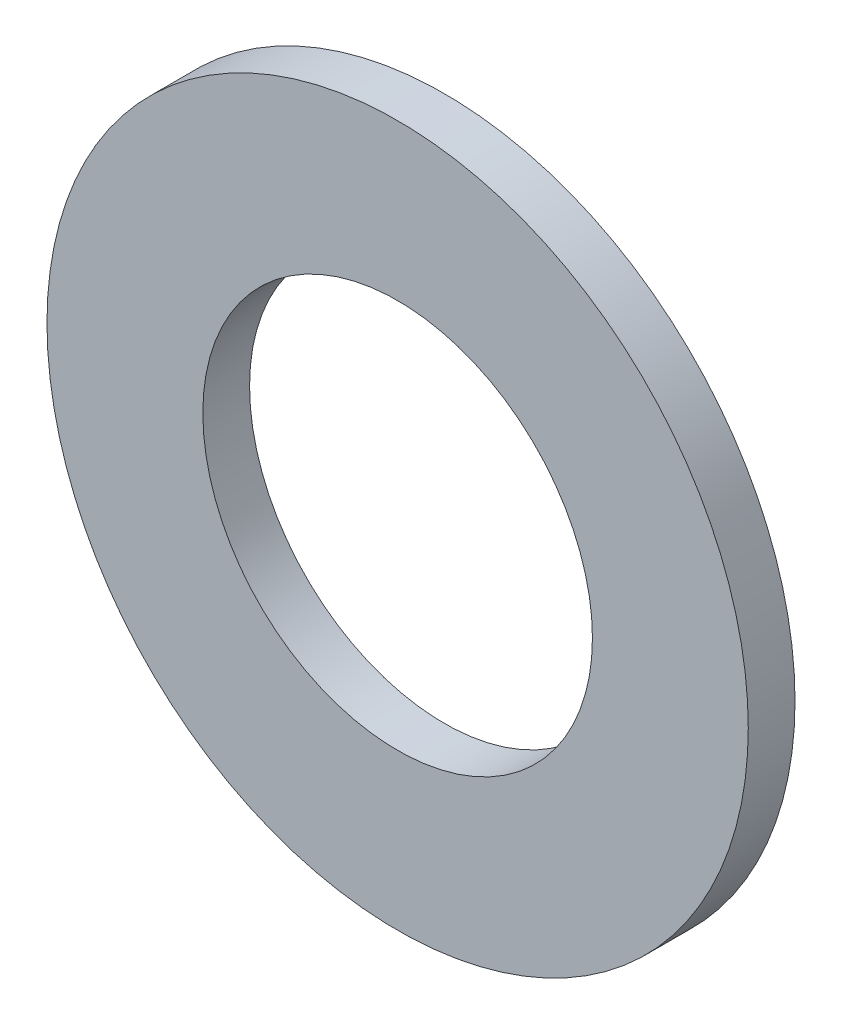
ISO-10303-21;
HEADER;
FILE_DESCRIPTION(('STEP AP214'),'2;1');
FILE_NAME('part.step','',(''),(''),'','','');
FILE_SCHEMA(('AUTOMOTIVE_DESIGN { 1 0 10303 214 1 1 1 1 }'));
ENDSEC;
DATA;
#1=APPLICATION_CONTEXT('core data for automotive mechanical design processes');
#2=APPLICATION_PROTOCOL_DEFINITION('international standard','automotive_design',2000,#1);
#3=PRODUCT_CONTEXT('',#1,'mechanical');
#4=PRODUCT('Part','Part','',(#3));
#5=PRODUCT_RELATED_PRODUCT_CATEGORY('part','',(#4));
#6=PRODUCT_DEFINITION_FORMATION('','',#4);
#7=PRODUCT_DEFINITION_CONTEXT('part definition',#1,'design');
#8=PRODUCT_DEFINITION('design','',#6,#7);
#9=PRODUCT_DEFINITION_SHAPE('','',#8);
#10=(LENGTH_UNIT() NAMED_UNIT(*) SI_UNIT(.MILLI.,.METRE.));
#11=(NAMED_UNIT(*) PLANE_ANGLE_UNIT() SI_UNIT($,.RADIAN.));
#12=(NAMED_UNIT(*) SI_UNIT($,.STERADIAN.) SOLID_ANGLE_UNIT());
#13=UNCERTAINTY_MEASURE_WITH_UNIT(LENGTH_MEASURE(1.E-05),#10,'distance_accuracy_value','');
#14=(GEOMETRIC_REPRESENTATION_CONTEXT(3) GLOBAL_UNCERTAINTY_ASSIGNED_CONTEXT((#13)) GLOBAL_UNIT_ASSIGNED_CONTEXT((#10,
#11,#12)) REPRESENTATION_CONTEXT('',''));
#15=CARTESIAN_POINT('',(0.,0.,0.));
#16=DIRECTION('',(0.,0.,1.));
#17=DIRECTION('',(1.,0.,0.));
#18=AXIS2_PLACEMENT_3D('',#15,#16,#17);
#19=CARTESIAN_POINT('',(0.,0.,3.));
#20=DIRECTION('',(0.,0.,1.));
#21=DIRECTION('',(1.,0.,0.));
#22=AXIS2_PLACEMENT_3D('',#19,#20,#21);
#23=PLANE('',#22);
#24=CARTESIAN_POINT('',(0.,0.,3.));
#25=DIRECTION('',(0.,0.,1.));
#26=DIRECTION('',(1.,0.,0.));
#27=AXIS2_PLACEMENT_3D('',#24,#25,#26);
#28=CIRCLE('',#27,22.5);
#29=CARTESIAN_POINT('',(22.5,0.,3.));
#30=VERTEX_POINT('',#29);
#31=EDGE_CURVE('E10',#30,#30,#28,.T.);
#32=ORIENTED_EDGE('',*,*,#31,.T.);
#33=EDGE_LOOP('',(#32));
#34=FACE_BOUND('',#33,.T.);
#35=CARTESIAN_POINT('',(0.,0.,3.));
#36=DIRECTION('',(0.,0.,1.));
#37=DIRECTION('',(1.,0.,0.));
#38=AXIS2_PLACEMENT_3D('',#35,#36,#37);
#39=CIRCLE('',#38,12.5);
#40=CARTESIAN_POINT('',(12.5,0.,3.));
#41=VERTEX_POINT('',#40);
#42=EDGE_CURVE('E40',#41,#41,#39,.T.);
#43=ORIENTED_EDGE('',*,*,#42,.F.);
#44=EDGE_LOOP('',(#43));
#45=FACE_BOUND('',#44,.T.);
#46=ADVANCED_FACE('F29',(#34,#45),#23,.T.);
#47=CARTESIAN_POINT('',(0.,0.,0.));
#48=DIRECTION('',(0.,0.,1.));
#49=DIRECTION('',(1.,0.,0.));
#50=AXIS2_PLACEMENT_3D('',#47,#48,#49);
#51=PLANE('',#50);
#52=CARTESIAN_POINT('',(0.,0.,0.));
#53=DIRECTION('',(0.,0.,1.));
#54=DIRECTION('',(1.,0.,0.));
#55=AXIS2_PLACEMENT_3D('',#52,#53,#54);
#56=CIRCLE('',#55,22.5);
#57=CARTESIAN_POINT('',(22.5,0.,0.));
#58=VERTEX_POINT('',#57);
#59=EDGE_CURVE('E33',#58,#58,#56,.T.);
#60=ORIENTED_EDGE('',*,*,#59,.F.);
#61=EDGE_LOOP('',(#60));
#62=FACE_BOUND('',#61,.T.);
#63=CARTESIAN_POINT('',(0.,0.,0.));
#64=DIRECTION('',(0.,0.,1.));
#65=DIRECTION('',(1.,0.,0.));
#66=AXIS2_PLACEMENT_3D('',#63,#64,#65);
#67=CIRCLE('',#66,12.5);
#68=CARTESIAN_POINT('',(12.5,0.,0.));
#69=VERTEX_POINT('',#68);
#70=EDGE_CURVE('E42',#69,#69,#67,.T.);
#71=ORIENTED_EDGE('',*,*,#70,.T.);
#72=EDGE_LOOP('',(#71));
#73=FACE_BOUND('',#72,.T.);
#74=ADVANCED_FACE('F52',(#62,#73),#51,.F.);
#75=CARTESIAN_POINT('',(0.,0.,3.));
#76=DIRECTION('',(0.,0.,-1.));
#77=DIRECTION('',(-1.,0.,0.));
#78=AXIS2_PLACEMENT_3D('',#75,#76,#77);
#79=CYLINDRICAL_SURFACE('',#78,22.5);
#80=ORIENTED_EDGE('',*,*,#31,.F.);
#81=EDGE_LOOP('',(#80));
#82=FACE_BOUND('',#81,.T.);
#83=ORIENTED_EDGE('',*,*,#59,.T.);
#84=EDGE_LOOP('',(#83));
#85=FACE_BOUND('',#84,.T.);
#86=ADVANCED_FACE('F31',(#82,#85),#79,.T.);
#87=CARTESIAN_POINT('',(0.,0.,3.));
#88=DIRECTION('',(0.,0.,-1.));
#89=DIRECTION('',(-1.,0.,0.));
#90=AXIS2_PLACEMENT_3D('',#87,#88,#89);
#91=CYLINDRICAL_SURFACE('',#90,12.5);
#92=ORIENTED_EDGE('',*,*,#42,.T.);
#93=EDGE_LOOP('',(#92));
#94=FACE_BOUND('',#93,.T.);
#95=ORIENTED_EDGE('',*,*,#70,.F.);
#96=EDGE_LOOP('',(#95));
#97=FACE_BOUND('',#96,.T.);
#98=ADVANCED_FACE('F48',(#94,#97),#91,.F.);
#99=CLOSED_SHELL('',(#46,#74,#86,#98));
#100=MANIFOLD_SOLID_BREP('B2',#99);
#101=ADVANCED_BREP_SHAPE_REPRESENTATION('',(#18,#100),#14);
#102=SHAPE_DEFINITION_REPRESENTATION(#9,#101);
ENDSEC;
END-ISO-10303-21;
